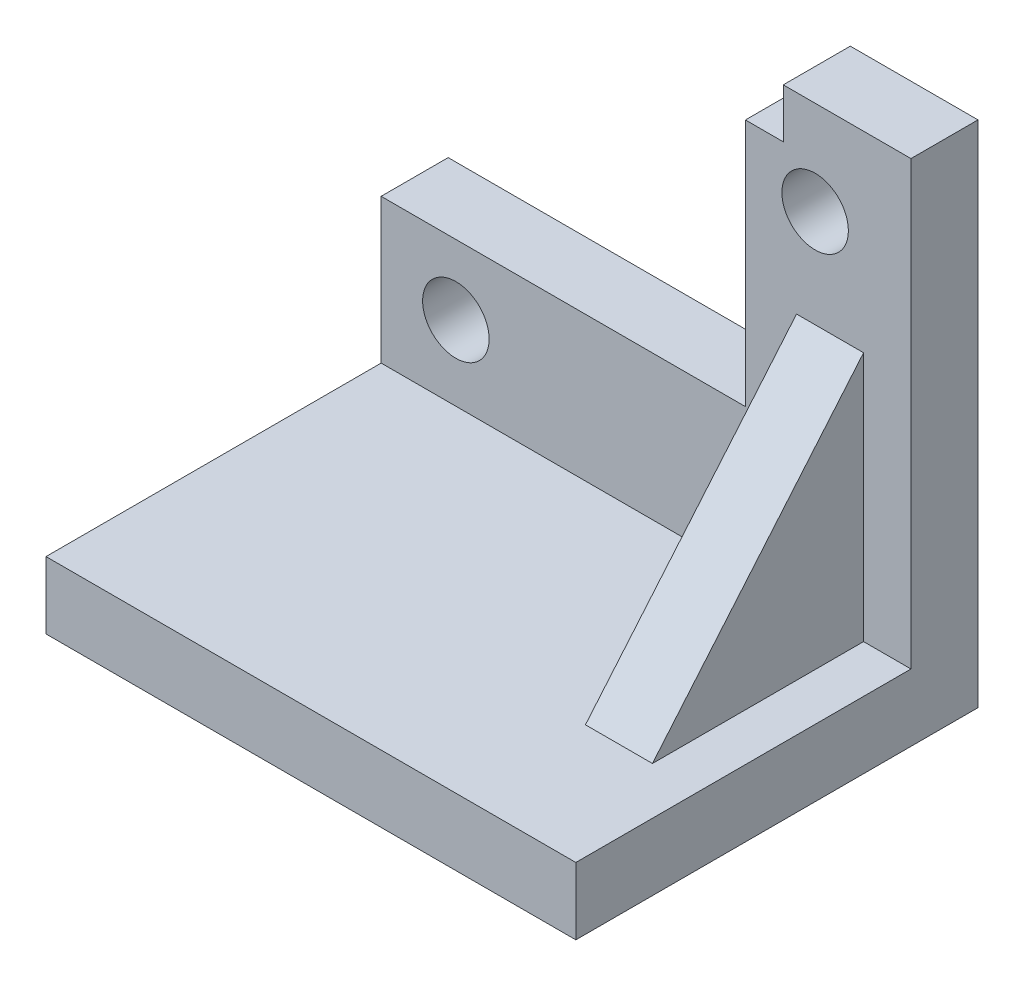
ISO-10303-21;
HEADER;
FILE_DESCRIPTION(('STEP AP214'),'2;1');
FILE_NAME('part.step','',(''),(''),'','','');
FILE_SCHEMA(('AUTOMOTIVE_DESIGN { 1 0 10303 214 1 1 1 1 }'));
ENDSEC;
DATA;
#1=APPLICATION_CONTEXT('core data for automotive mechanical design processes');
#2=APPLICATION_PROTOCOL_DEFINITION('international standard','automotive_design',2000,#1);
#3=PRODUCT_CONTEXT('',#1,'mechanical');
#4=PRODUCT('Part','Part','',(#3));
#5=PRODUCT_RELATED_PRODUCT_CATEGORY('part','',(#4));
#6=PRODUCT_DEFINITION_FORMATION('','',#4);
#7=PRODUCT_DEFINITION_CONTEXT('part definition',#1,'design');
#8=PRODUCT_DEFINITION('design','',#6,#7);
#9=PRODUCT_DEFINITION_SHAPE('','',#8);
#10=(LENGTH_UNIT() NAMED_UNIT(*) SI_UNIT(.MILLI.,.METRE.));
#11=(NAMED_UNIT(*) PLANE_ANGLE_UNIT() SI_UNIT($,.RADIAN.));
#12=(NAMED_UNIT(*) SI_UNIT($,.STERADIAN.) SOLID_ANGLE_UNIT());
#13=UNCERTAINTY_MEASURE_WITH_UNIT(LENGTH_MEASURE(1.E-05),#10,'distance_accuracy_value','');
#14=(GEOMETRIC_REPRESENTATION_CONTEXT(3) GLOBAL_UNCERTAINTY_ASSIGNED_CONTEXT((#13)) GLOBAL_UNIT_ASSIGNED_CONTEXT((#10,
#11,#12)) REPRESENTATION_CONTEXT('',''));
#15=CARTESIAN_POINT('',(0.,0.,0.));
#16=DIRECTION('',(0.,0.,1.));
#17=DIRECTION('',(1.,0.,0.));
#18=AXIS2_PLACEMENT_3D('',#15,#16,#17);
#19=CARTESIAN_POINT('',(0.,0.,3.175));
#20=DIRECTION('',(0.,0.,1.));
#21=DIRECTION('',(1.,0.,0.));
#22=AXIS2_PLACEMENT_3D('',#19,#20,#21);
#23=PLANE('',#22);
#24=DIRECTION('',(0.,-1.,0.));
#25=VECTOR('',#24,1.);
#26=CARTESIAN_POINT('',(6.81650883570193,3.57002461571214,3.175));
#27=LINE('',#26,#25);
#28=CARTESIAN_POINT('',(6.81650883570193,3.57002461571214,3.175));
#29=VERTEX_POINT('',#28);
#30=CARTESIAN_POINT('',(6.81650883570193,-8.28040490381666,3.175));
#31=VERTEX_POINT('',#30);
#32=EDGE_CURVE('E532',#29,#31,#27,.T.);
#33=ORIENTED_EDGE('',*,*,#32,.F.);
#34=DIRECTION('',(-1.,0.,0.));
#35=VECTOR('',#34,1.);
#36=CARTESIAN_POINT('',(9.99150883570193,3.57002461571214,3.175));
#37=LINE('',#36,#35);
#38=CARTESIAN_POINT('',(9.99150883570193,3.57002461571214,3.175));
#39=VERTEX_POINT('',#38);
#40=EDGE_CURVE('E208',#39,#29,#37,.T.);
#41=ORIENTED_EDGE('',*,*,#40,.F.);
#42=DIRECTION('',(0.,1.,0.));
#43=VECTOR('',#42,1.);
#44=CARTESIAN_POINT('',(9.99150883570193,-8.28040490381666,3.175));
#45=LINE('',#44,#43);
#46=CARTESIAN_POINT('',(9.99150883570193,-8.28040490381666,3.175));
#47=VERTEX_POINT('',#46);
#48=EDGE_CURVE('E129',#47,#39,#45,.T.);
#49=ORIENTED_EDGE('',*,*,#48,.F.);
#50=DIRECTION('',(1.,0.,0.));
#51=VECTOR('',#50,1.);
#52=CARTESIAN_POINT('',(-11.8607861709948,-8.28040490381666,3.175));
#53=LINE('',#52,#51);
#54=CARTESIAN_POINT('',(12.2372138290052,-8.28040490381666,3.175));
#55=VERTEX_POINT('',#54);
#56=EDGE_CURVE('E217',#47,#55,#53,.T.);
#57=ORIENTED_EDGE('',*,*,#56,.T.);
#58=DIRECTION('',(0.,1.,0.));
#59=VECTOR('',#58,1.);
#60=CARTESIAN_POINT('',(12.2372138290052,-8.28040490381666,3.175));
#61=LINE('',#60,#59);
#62=CARTESIAN_POINT('',(12.2372138290052,12.6585950961833,3.175));
#63=VERTEX_POINT('',#62);
#64=EDGE_CURVE('E291',#55,#63,#61,.T.);
#65=ORIENTED_EDGE('',*,*,#64,.T.);
#66=DIRECTION('',(-1.,0.,0.));
#67=VECTOR('',#66,1.);
#68=CARTESIAN_POINT('',(12.2372138290052,12.6585950961833,3.175));
#69=LINE('',#68,#67);
#70=CARTESIAN_POINT('',(6.18817038186677,12.6585950961833,3.175));
#71=VERTEX_POINT('',#70);
#72=EDGE_CURVE('E294',#63,#71,#69,.T.);
#73=ORIENTED_EDGE('',*,*,#72,.T.);
#74=DIRECTION('',(0.,1.,0.));
#75=VECTOR('',#74,1.);
#76=CARTESIAN_POINT('',(6.18817038186677,10.3218119533511,3.175));
#77=LINE('',#76,#75);
#78=CARTESIAN_POINT('',(6.18817038186677,10.3218119533511,3.175));
#79=VERTEX_POINT('',#78);
#80=EDGE_CURVE('E297',#79,#71,#77,.T.);
#81=ORIENTED_EDGE('',*,*,#80,.F.);
#82=DIRECTION('',(1.,0.,0.));
#83=VECTOR('',#82,1.);
#84=CARTESIAN_POINT('',(4.39521382900517,10.3218119533511,3.175));
#85=LINE('',#84,#83);
#86=CARTESIAN_POINT('',(4.39521382900517,10.3218119533511,3.175));
#87=VERTEX_POINT('',#86);
#88=EDGE_CURVE('E301',#87,#79,#85,.T.);
#89=ORIENTED_EDGE('',*,*,#88,.F.);
#90=DIRECTION('',(0.,-1.,0.));
#91=VECTOR('',#90,1.);
#92=CARTESIAN_POINT('',(4.39521382900517,10.3218119533511,3.175));
#93=LINE('',#92,#91);
#94=CARTESIAN_POINT('',(4.39521382900517,-1.43840490381666,3.175));
#95=VERTEX_POINT('',#94);
#96=EDGE_CURVE('E305',#87,#95,#93,.T.);
#97=ORIENTED_EDGE('',*,*,#96,.T.);
#98=DIRECTION('',(-1.,0.,0.));
#99=VECTOR('',#98,1.);
#100=CARTESIAN_POINT('',(4.39521382900517,-1.43840490381666,3.175));
#101=LINE('',#100,#99);
#102=CARTESIAN_POINT('',(-12.8607861709948,-1.43840490381666,3.175));
#103=VERTEX_POINT('',#102);
#104=EDGE_CURVE('E308',#95,#103,#101,.T.);
#105=ORIENTED_EDGE('',*,*,#104,.T.);
#106=DIRECTION('',(0.,-1.,0.));
#107=VECTOR('',#106,1.);
#108=CARTESIAN_POINT('',(-12.8607861709948,-1.43840490381666,3.175));
#109=LINE('',#108,#107);
#110=CARTESIAN_POINT('',(-12.8607861709948,-8.28040490381666,3.175));
#111=VERTEX_POINT('',#110);
#112=EDGE_CURVE('E235',#103,#111,#109,.T.);
#113=ORIENTED_EDGE('',*,*,#112,.T.);
#114=EDGE_CURVE('E287',#111,#31,#53,.T.);
#115=ORIENTED_EDGE('',*,*,#114,.T.);
#116=EDGE_LOOP('',(#33,#41,#49,#57,#65,#73,#81,#89,#97,#105,#113,#115));
#117=FACE_BOUND('',#116,.T.);
#118=CARTESIAN_POINT('',(-9.32078617099483,-4.74040490381666,3.175));
#119=DIRECTION('',(0.,0.,1.));
#120=DIRECTION('',(1.,0.,0.));
#121=AXIS2_PLACEMENT_3D('',#118,#119,#120);
#122=CIRCLE('',#121,1.5748);
#123=CARTESIAN_POINT('',(-7.74598617099483,-4.74040490381666,3.175));
#124=VERTEX_POINT('',#123);
#125=EDGE_CURVE('E271',#124,#124,#122,.T.);
#126=ORIENTED_EDGE('',*,*,#125,.F.);
#127=EDGE_LOOP('',(#126));
#128=FACE_BOUND('',#127,.T.);
#129=CARTESIAN_POINT('',(7.69721382900516,8.21359509618334,3.175));
#130=DIRECTION('',(0.,0.,1.));
#131=DIRECTION('',(1.,0.,0.));
#132=AXIS2_PLACEMENT_3D('',#129,#130,#131);
#133=CIRCLE('',#132,1.5748);
#134=CARTESIAN_POINT('',(9.27201382900516,8.21359509618334,3.175));
#135=VERTEX_POINT('',#134);
#136=EDGE_CURVE('E279',#135,#135,#133,.T.);
#137=ORIENTED_EDGE('',*,*,#136,.F.);
#138=EDGE_LOOP('',(#137));
#139=FACE_BOUND('',#138,.T.);
#140=ADVANCED_FACE('F105',(#117,#128,#139),#23,.T.);
#141=CARTESIAN_POINT('',(12.2372138290052,-8.28040490381666,19.05));
#142=DIRECTION('',(0.,1.,0.));
#143=DIRECTION('',(0.,0.,1.));
#144=AXIS2_PLACEMENT_3D('',#141,#142,#143);
#145=PLANE('',#144);
#146=DIRECTION('',(1.,0.,0.));
#147=VECTOR('',#146,1.);
#148=CARTESIAN_POINT('',(6.81650883570193,-8.28040490381666,13.175));
#149=LINE('',#148,#147);
#150=CARTESIAN_POINT('',(6.81650883570193,-8.28040490381666,13.175));
#151=VERTEX_POINT('',#150);
#152=CARTESIAN_POINT('',(9.99150883570193,-8.28040490381666,13.175));
#153=VERTEX_POINT('',#152);
#154=EDGE_CURVE('E199',#151,#153,#149,.T.);
#155=ORIENTED_EDGE('',*,*,#154,.F.);
#156=DIRECTION('',(0.,0.,-1.));
#157=VECTOR('',#156,1.);
#158=CARTESIAN_POINT('',(6.81650883570193,-8.28040490381666,13.175));
#159=LINE('',#158,#157);
#160=EDGE_CURVE('E219',#151,#31,#159,.T.);
#161=ORIENTED_EDGE('',*,*,#160,.T.);
#162=ORIENTED_EDGE('',*,*,#114,.F.);
#163=DIRECTION('',(0.,0.,1.));
#164=VECTOR('',#163,1.);
#165=CARTESIAN_POINT('',(-12.8607861709948,-8.28040490381666,0.));
#166=LINE('',#165,#164);
#167=CARTESIAN_POINT('',(-12.8607861709948,-8.28040490381666,19.05));
#168=VERTEX_POINT('',#167);
#169=EDGE_CURVE('E230',#111,#168,#166,.T.);
#170=ORIENTED_EDGE('',*,*,#169,.T.);
#171=DIRECTION('',(1.,0.,0.));
#172=VECTOR('',#171,1.);
#173=CARTESIAN_POINT('',(12.2372138290052,-8.28040490381666,19.05));
#174=LINE('',#173,#172);
#175=CARTESIAN_POINT('',(12.2372138290052,-8.28040490381666,19.05));
#176=VERTEX_POINT('',#175);
#177=EDGE_CURVE('E257',#168,#176,#174,.T.);
#178=ORIENTED_EDGE('',*,*,#177,.T.);
#179=DIRECTION('',(0.,0.,-1.));
#180=VECTOR('',#179,1.);
#181=CARTESIAN_POINT('',(12.2372138290052,-8.28040490381666,19.05));
#182=LINE('',#181,#180);
#183=EDGE_CURVE('E264',#176,#55,#182,.T.);
#184=ORIENTED_EDGE('',*,*,#183,.T.);
#185=ORIENTED_EDGE('',*,*,#56,.F.);
#186=DIRECTION('',(0.,0.,-1.));
#187=VECTOR('',#186,1.);
#188=CARTESIAN_POINT('',(9.99150883570193,-8.28040490381666,13.175));
#189=LINE('',#188,#187);
#190=EDGE_CURVE('E207',#153,#47,#189,.T.);
#191=ORIENTED_EDGE('',*,*,#190,.F.);
#192=EDGE_LOOP('',(#155,#161,#162,#170,#178,#184,#185,#191));
#193=FACE_BOUND('',#192,.T.);
#194=ADVANCED_FACE('F215',(#193),#145,.T.);
#195=CARTESIAN_POINT('',(0.,0.,0.));
#196=DIRECTION('',(0.,0.,1.));
#197=DIRECTION('',(1.,0.,0.));
#198=AXIS2_PLACEMENT_3D('',#195,#196,#197);
#199=PLANE('',#198);
#200=DIRECTION('',(-1.,0.,0.));
#201=VECTOR('',#200,1.);
#202=CARTESIAN_POINT('',(12.2372138290052,-11.4554049038167,0.));
#203=LINE('',#202,#201);
#204=CARTESIAN_POINT('',(12.2372138290052,-11.4554049038167,0.));
#205=VERTEX_POINT('',#204);
#206=CARTESIAN_POINT('',(-12.8607861709948,-11.4554049038167,0.));
#207=VERTEX_POINT('',#206);
#208=EDGE_CURVE('E249',#205,#207,#203,.T.);
#209=ORIENTED_EDGE('',*,*,#208,.T.);
#210=DIRECTION('',(0.,-1.,0.));
#211=VECTOR('',#210,1.);
#212=CARTESIAN_POINT('',(-12.8607861709948,-1.43840490381666,0.));
#213=LINE('',#212,#211);
#214=CARTESIAN_POINT('',(-12.8607861709948,-1.43840490381666,0.));
#215=VERTEX_POINT('',#214);
#216=EDGE_CURVE('E238',#215,#207,#213,.T.);
#217=ORIENTED_EDGE('',*,*,#216,.F.);
#218=DIRECTION('',(-1.,0.,0.));
#219=VECTOR('',#218,1.);
#220=CARTESIAN_POINT('',(4.39521382900517,-1.43840490381666,0.));
#221=LINE('',#220,#219);
#222=CARTESIAN_POINT('',(4.39521382900517,-1.43840490381666,0.));
#223=VERTEX_POINT('',#222);
#224=EDGE_CURVE('E330',#223,#215,#221,.T.);
#225=ORIENTED_EDGE('',*,*,#224,.F.);
#226=DIRECTION('',(0.,-1.,0.));
#227=VECTOR('',#226,1.);
#228=CARTESIAN_POINT('',(4.39521382900517,7.82738812093123,0.));
#229=LINE('',#228,#227);
#230=CARTESIAN_POINT('',(4.39521382900517,10.3218119533511,0.));
#231=VERTEX_POINT('',#230);
#232=EDGE_CURVE('E327',#231,#223,#229,.T.);
#233=ORIENTED_EDGE('',*,*,#232,.F.);
#234=DIRECTION('',(1.,0.,0.));
#235=VECTOR('',#234,1.);
#236=CARTESIAN_POINT('',(4.39521382900517,10.3218119533511,0.));
#237=LINE('',#236,#235);
#238=CARTESIAN_POINT('',(6.18817038186677,10.3218119533511,0.));
#239=VERTEX_POINT('',#238);
#240=EDGE_CURVE('E323',#231,#239,#237,.T.);
#241=ORIENTED_EDGE('',*,*,#240,.T.);
#242=DIRECTION('',(0.,1.,0.));
#243=VECTOR('',#242,1.);
#244=CARTESIAN_POINT('',(6.18817038186677,10.3218119533511,0.));
#245=LINE('',#244,#243);
#246=CARTESIAN_POINT('',(6.18817038186677,12.6585950961833,0.));
#247=VERTEX_POINT('',#246);
#248=EDGE_CURVE('E319',#239,#247,#245,.T.);
#249=ORIENTED_EDGE('',*,*,#248,.T.);
#250=DIRECTION('',(-1.,0.,0.));
#251=VECTOR('',#250,1.);
#252=CARTESIAN_POINT('',(7.69721382900516,12.6585950961833,0.));
#253=LINE('',#252,#251);
#254=CARTESIAN_POINT('',(12.2372138290052,12.6585950961833,0.));
#255=VERTEX_POINT('',#254);
#256=EDGE_CURVE('E315',#255,#247,#253,.T.);
#257=ORIENTED_EDGE('',*,*,#256,.F.);
#258=DIRECTION('',(0.,1.,0.));
#259=VECTOR('',#258,1.);
#260=CARTESIAN_POINT('',(12.2372138290052,-8.28040490381666,0.));
#261=LINE('',#260,#259);
#262=EDGE_CURVE('E283',#205,#255,#261,.T.);
#263=ORIENTED_EDGE('',*,*,#262,.F.);
#264=EDGE_LOOP('',(#209,#217,#225,#233,#241,#249,#257,#263));
#265=FACE_BOUND('',#264,.T.);
#266=CARTESIAN_POINT('',(7.69721382900516,8.21359509618334,0.));
#267=DIRECTION('',(0.,0.,1.));
#268=DIRECTION('',(1.,0.,0.));
#269=AXIS2_PLACEMENT_3D('',#266,#267,#268);
#270=CIRCLE('',#269,1.5748);
#271=CARTESIAN_POINT('',(9.27201382900516,8.21359509618334,0.));
#272=VERTEX_POINT('',#271);
#273=EDGE_CURVE('E275',#272,#272,#270,.T.);
#274=ORIENTED_EDGE('',*,*,#273,.T.);
#275=EDGE_LOOP('',(#274));
#276=FACE_BOUND('',#275,.T.);
#277=CARTESIAN_POINT('',(-9.32078617099483,-4.74040490381666,0.));
#278=DIRECTION('',(0.,0.,1.));
#279=DIRECTION('',(1.,0.,0.));
#280=AXIS2_PLACEMENT_3D('',#277,#278,#279);
#281=CIRCLE('',#280,1.5748);
#282=CARTESIAN_POINT('',(-7.74598617099483,-4.74040490381666,0.));
#283=VERTEX_POINT('',#282);
#284=EDGE_CURVE('E267',#283,#283,#281,.T.);
#285=ORIENTED_EDGE('',*,*,#284,.T.);
#286=EDGE_LOOP('',(#285));
#287=FACE_BOUND('',#286,.T.);
#288=ADVANCED_FACE('F353',(#265,#276,#287),#199,.F.);
#289=CARTESIAN_POINT('',(12.2372138290052,-8.28040490381666,3.175));
#290=DIRECTION('',(-1.,0.,0.));
#291=DIRECTION('',(0.,0.,1.));
#292=AXIS2_PLACEMENT_3D('',#289,#290,#291);
#293=PLANE('',#292);
#294=ORIENTED_EDGE('',*,*,#262,.T.);
#295=DIRECTION('',(0.,0.,-1.));
#296=VECTOR('',#295,1.);
#297=CARTESIAN_POINT('',(12.2372138290052,12.6585950961833,3.175));
#298=LINE('',#297,#296);
#299=EDGE_CURVE('E12',#63,#255,#298,.T.);
#300=ORIENTED_EDGE('',*,*,#299,.F.);
#301=ORIENTED_EDGE('',*,*,#64,.F.);
#302=ORIENTED_EDGE('',*,*,#183,.F.);
#303=DIRECTION('',(0.,-1.,0.));
#304=VECTOR('',#303,1.);
#305=CARTESIAN_POINT('',(12.2372138290052,-8.28040490381666,19.05));
#306=LINE('',#305,#304);
#307=CARTESIAN_POINT('',(12.2372138290052,-11.4554049038167,19.05));
#308=VERTEX_POINT('',#307);
#309=EDGE_CURVE('E250',#176,#308,#306,.T.);
#310=ORIENTED_EDGE('',*,*,#309,.T.);
#311=DIRECTION('',(0.,0.,-1.));
#312=VECTOR('',#311,1.);
#313=CARTESIAN_POINT('',(12.2372138290052,-11.4554049038167,19.05));
#314=LINE('',#313,#312);
#315=EDGE_CURVE('E261',#308,#205,#314,.T.);
#316=ORIENTED_EDGE('',*,*,#315,.T.);
#317=EDGE_LOOP('',(#294,#300,#301,#302,#310,#316));
#318=FACE_BOUND('',#317,.T.);
#319=ADVANCED_FACE('F107',(#318),#293,.F.);
#320=CARTESIAN_POINT('',(7.69721382900516,12.6585950961833,3.175));
#321=DIRECTION('',(0.,-1.,0.));
#322=DIRECTION('',(1.,0.,0.));
#323=AXIS2_PLACEMENT_3D('',#320,#321,#322);
#324=PLANE('',#323);
#325=ORIENTED_EDGE('',*,*,#256,.T.);
#326=DIRECTION('',(0.,0.,-1.));
#327=VECTOR('',#326,1.);
#328=CARTESIAN_POINT('',(6.18817038186677,12.6585950961833,3.175));
#329=LINE('',#328,#327);
#330=EDGE_CURVE('E114',#71,#247,#329,.T.);
#331=ORIENTED_EDGE('',*,*,#330,.F.);
#332=ORIENTED_EDGE('',*,*,#72,.F.);
#333=ORIENTED_EDGE('',*,*,#299,.T.);
#334=EDGE_LOOP('',(#325,#331,#332,#333));
#335=FACE_BOUND('',#334,.T.);
#336=ADVANCED_FACE('F350',(#335),#324,.F.);
#337=CARTESIAN_POINT('',(6.18817038186677,10.3218119533511,3.175));
#338=DIRECTION('',(-1.,0.,0.));
#339=DIRECTION('',(0.,0.,1.));
#340=AXIS2_PLACEMENT_3D('',#337,#338,#339);
#341=PLANE('',#340);
#342=ORIENTED_EDGE('',*,*,#248,.F.);
#343=DIRECTION('',(0.,0.,-1.));
#344=VECTOR('',#343,1.);
#345=CARTESIAN_POINT('',(6.18817038186677,10.3218119533511,3.175));
#346=LINE('',#345,#344);
#347=EDGE_CURVE('E340',#79,#239,#346,.T.);
#348=ORIENTED_EDGE('',*,*,#347,.F.);
#349=ORIENTED_EDGE('',*,*,#80,.T.);
#350=ORIENTED_EDGE('',*,*,#330,.T.);
#351=EDGE_LOOP('',(#342,#348,#349,#350));
#352=FACE_BOUND('',#351,.T.);
#353=ADVANCED_FACE('F346',(#352),#341,.T.);
#354=CARTESIAN_POINT('',(4.39521382900517,10.3218119533511,3.175));
#355=DIRECTION('',(0.,1.,0.));
#356=DIRECTION('',(0.,0.,1.));
#357=AXIS2_PLACEMENT_3D('',#354,#355,#356);
#358=PLANE('',#357);
#359=ORIENTED_EDGE('',*,*,#240,.F.);
#360=DIRECTION('',(0.,0.,-1.));
#361=VECTOR('',#360,1.);
#362=CARTESIAN_POINT('',(4.39521382900517,10.3218119533511,3.175));
#363=LINE('',#362,#361);
#364=EDGE_CURVE('E336',#87,#231,#363,.T.);
#365=ORIENTED_EDGE('',*,*,#364,.F.);
#366=ORIENTED_EDGE('',*,*,#88,.T.);
#367=ORIENTED_EDGE('',*,*,#347,.T.);
#368=EDGE_LOOP('',(#359,#365,#366,#367));
#369=FACE_BOUND('',#368,.T.);
#370=ADVANCED_FACE('F358',(#369),#358,.T.);
#371=CARTESIAN_POINT('',(4.39521382900517,7.82738812093123,3.175));
#372=DIRECTION('',(1.,0.,0.));
#373=DIRECTION('',(0.,0.,-1.));
#374=AXIS2_PLACEMENT_3D('',#371,#372,#373);
#375=PLANE('',#374);
#376=ORIENTED_EDGE('',*,*,#232,.T.);
#377=DIRECTION('',(0.,0.,-1.));
#378=VECTOR('',#377,1.);
#379=CARTESIAN_POINT('',(4.39521382900517,-1.43840490381666,3.175));
#380=LINE('',#379,#378);
#381=EDGE_CURVE('E311',#95,#223,#380,.T.);
#382=ORIENTED_EDGE('',*,*,#381,.F.);
#383=ORIENTED_EDGE('',*,*,#96,.F.);
#384=ORIENTED_EDGE('',*,*,#364,.T.);
#385=EDGE_LOOP('',(#376,#382,#383,#384));
#386=FACE_BOUND('',#385,.T.);
#387=ADVANCED_FACE('F387',(#386),#375,.F.);
#388=CARTESIAN_POINT('',(4.39521382900517,-1.43840490381666,3.175));
#389=DIRECTION('',(0.,-1.,0.));
#390=DIRECTION('',(1.,0.,0.));
#391=AXIS2_PLACEMENT_3D('',#388,#389,#390);
#392=PLANE('',#391);
#393=ORIENTED_EDGE('',*,*,#224,.T.);
#394=DIRECTION('',(0.,0.,1.));
#395=VECTOR('',#394,1.);
#396=CARTESIAN_POINT('',(-12.8607861709948,-1.43840490381666,0.));
#397=LINE('',#396,#395);
#398=EDGE_CURVE('E242',#215,#103,#397,.T.);
#399=ORIENTED_EDGE('',*,*,#398,.T.);
#400=ORIENTED_EDGE('',*,*,#104,.F.);
#401=ORIENTED_EDGE('',*,*,#381,.T.);
#402=EDGE_LOOP('',(#393,#399,#400,#401));
#403=FACE_BOUND('',#402,.T.);
#404=ADVANCED_FACE('F385',(#403),#392,.F.);
#405=CARTESIAN_POINT('',(7.69721382900516,8.21359509618334,3.175));
#406=DIRECTION('',(0.,0.,-1.));
#407=DIRECTION('',(-1.,0.,0.));
#408=AXIS2_PLACEMENT_3D('',#405,#406,#407);
#409=CYLINDRICAL_SURFACE('',#408,1.5748);
#410=ORIENTED_EDGE('',*,*,#136,.T.);
#411=EDGE_LOOP('',(#410));
#412=FACE_BOUND('',#411,.T.);
#413=ORIENTED_EDGE('',*,*,#273,.F.);
#414=EDGE_LOOP('',(#413));
#415=FACE_BOUND('',#414,.T.);
#416=ADVANCED_FACE('F394',(#412,#415),#409,.F.);
#417=CARTESIAN_POINT('',(-9.32078617099483,-4.74040490381666,3.175));
#418=DIRECTION('',(0.,0.,-1.));
#419=DIRECTION('',(-1.,0.,0.));
#420=AXIS2_PLACEMENT_3D('',#417,#418,#419);
#421=CYLINDRICAL_SURFACE('',#420,1.5748);
#422=ORIENTED_EDGE('',*,*,#125,.T.);
#423=EDGE_LOOP('',(#422));
#424=FACE_BOUND('',#423,.T.);
#425=ORIENTED_EDGE('',*,*,#284,.F.);
#426=EDGE_LOOP('',(#425));
#427=FACE_BOUND('',#426,.T.);
#428=ADVANCED_FACE('F433',(#424,#427),#421,.F.);
#429=CARTESIAN_POINT('',(12.2372138290052,-11.4554049038167,19.05));
#430=DIRECTION('',(0.,-1.,0.));
#431=DIRECTION('',(0.,0.,-1.));
#432=AXIS2_PLACEMENT_3D('',#429,#430,#431);
#433=PLANE('',#432);
#434=ORIENTED_EDGE('',*,*,#208,.F.);
#435=ORIENTED_EDGE('',*,*,#315,.F.);
#436=DIRECTION('',(-1.,0.,0.));
#437=VECTOR('',#436,1.);
#438=CARTESIAN_POINT('',(12.2372138290052,-11.4554049038167,19.05));
#439=LINE('',#438,#437);
#440=CARTESIAN_POINT('',(-12.8607861709948,-11.4554049038167,19.05));
#441=VERTEX_POINT('',#440);
#442=EDGE_CURVE('E254',#308,#441,#439,.T.);
#443=ORIENTED_EDGE('',*,*,#442,.T.);
#444=DIRECTION('',(0.,0.,1.));
#445=VECTOR('',#444,1.);
#446=CARTESIAN_POINT('',(-12.8607861709948,-11.4554049038167,0.));
#447=LINE('',#446,#445);
#448=EDGE_CURVE('E231',#207,#441,#447,.T.);
#449=ORIENTED_EDGE('',*,*,#448,.F.);
#450=EDGE_LOOP('',(#434,#435,#443,#449));
#451=FACE_BOUND('',#450,.T.);
#452=ADVANCED_FACE('F374',(#451),#433,.T.);
#453=CARTESIAN_POINT('',(0.,0.,19.05));
#454=DIRECTION('',(0.,0.,-1.));
#455=DIRECTION('',(-1.,0.,0.));
#456=AXIS2_PLACEMENT_3D('',#453,#454,#455);
#457=PLANE('',#456);
#458=ORIENTED_EDGE('',*,*,#309,.F.);
#459=ORIENTED_EDGE('',*,*,#177,.F.);
#460=DIRECTION('',(0.,-1.,0.));
#461=VECTOR('',#460,1.);
#462=CARTESIAN_POINT('',(-12.8607861709948,-11.4554049038167,19.05));
#463=LINE('',#462,#461);
#464=EDGE_CURVE('E222',#168,#441,#463,.T.);
#465=ORIENTED_EDGE('',*,*,#464,.T.);
#466=ORIENTED_EDGE('',*,*,#442,.F.);
#467=EDGE_LOOP('',(#458,#459,#465,#466));
#468=FACE_BOUND('',#467,.T.);
#469=ADVANCED_FACE('F378',(#468),#457,.F.);
#470=CARTESIAN_POINT('',(-12.8607861709948,-1.43840490381666,0.));
#471=DIRECTION('',(-1.,0.,0.));
#472=DIRECTION('',(0.,-1.,0.));
#473=AXIS2_PLACEMENT_3D('',#470,#471,#472);
#474=PLANE('',#473);
#475=ORIENTED_EDGE('',*,*,#112,.F.);
#476=ORIENTED_EDGE('',*,*,#398,.F.);
#477=ORIENTED_EDGE('',*,*,#216,.T.);
#478=ORIENTED_EDGE('',*,*,#448,.T.);
#479=ORIENTED_EDGE('',*,*,#464,.F.);
#480=ORIENTED_EDGE('',*,*,#169,.F.);
#481=EDGE_LOOP('',(#475,#476,#477,#478,#479,#480));
#482=FACE_BOUND('',#481,.T.);
#483=ADVANCED_FACE('F372',(#482),#474,.T.);
#484=CARTESIAN_POINT('',(6.81650883570193,3.57002461571214,13.175));
#485=DIRECTION('',(1.,0.,0.));
#486=DIRECTION('',(0.,1.,0.));
#487=AXIS2_PLACEMENT_3D('',#484,#485,#486);
#488=PLANE('',#487);
#489=ORIENTED_EDGE('',*,*,#160,.F.);
#490=DIRECTION('',(0.,0.764253336088259,-0.644916148253373));
#491=VECTOR('',#490,1.);
#492=CARTESIAN_POINT('',(6.81650883570193,-1.35876856228616,7.33416838277967));
#493=LINE('',#492,#491);
#494=EDGE_CURVE('E121',#151,#29,#493,.T.);
#495=ORIENTED_EDGE('',*,*,#494,.T.);
#496=ORIENTED_EDGE('',*,*,#32,.T.);
#497=EDGE_LOOP('',(#489,#495,#496));
#498=FACE_BOUND('',#497,.T.);
#499=ADVANCED_FACE('F504',(#498),#488,.F.);
#500=CARTESIAN_POINT('',(9.99150883570193,-8.28040490381666,13.175));
#501=DIRECTION('',(-1.,0.,0.));
#502=DIRECTION('',(0.,-1.,0.));
#503=AXIS2_PLACEMENT_3D('',#500,#501,#502);
#504=PLANE('',#503);
#505=ORIENTED_EDGE('',*,*,#48,.T.);
#506=DIRECTION('',(0.,0.764253336088259,-0.644916148253373));
#507=VECTOR('',#506,1.);
#508=CARTESIAN_POINT('',(9.99150883570193,3.57002461571214,3.175));
#509=LINE('',#508,#507);
#510=EDGE_CURVE('E202',#153,#39,#509,.T.);
#511=ORIENTED_EDGE('',*,*,#510,.F.);
#512=ORIENTED_EDGE('',*,*,#190,.T.);
#513=EDGE_LOOP('',(#505,#511,#512));
#514=FACE_BOUND('',#513,.T.);
#515=ADVANCED_FACE('F212',(#514),#504,.F.);
#516=CARTESIAN_POINT('',(-12.8607861709948,3.57002461571214,3.175));
#517=DIRECTION('',(0.,-0.644916148253373,-0.764253336088259));
#518=DIRECTION('',(0.,0.764253336088259,-0.644916148253373));
#519=AXIS2_PLACEMENT_3D('',#516,#517,#518);
#520=PLANE('',#519);
#521=ORIENTED_EDGE('',*,*,#154,.T.);
#522=ORIENTED_EDGE('',*,*,#510,.T.);
#523=ORIENTED_EDGE('',*,*,#40,.T.);
#524=ORIENTED_EDGE('',*,*,#494,.F.);
#525=EDGE_LOOP('',(#521,#522,#523,#524));
#526=FACE_BOUND('',#525,.T.);
#527=ADVANCED_FACE('F201',(#526),#520,.F.);
#528=CLOSED_SHELL('',(#140,#194,#288,#319,#336,#353,#370,#387,#404,#416,#428,#452,#469,#483,
#499,#515,#527));
#529=MANIFOLD_SOLID_BREP('B2',#528);
#530=ADVANCED_BREP_SHAPE_REPRESENTATION('',(#18,#529),#14);
#531=SHAPE_DEFINITION_REPRESENTATION(#9,#530);
ENDSEC;
END-ISO-10303-21;
